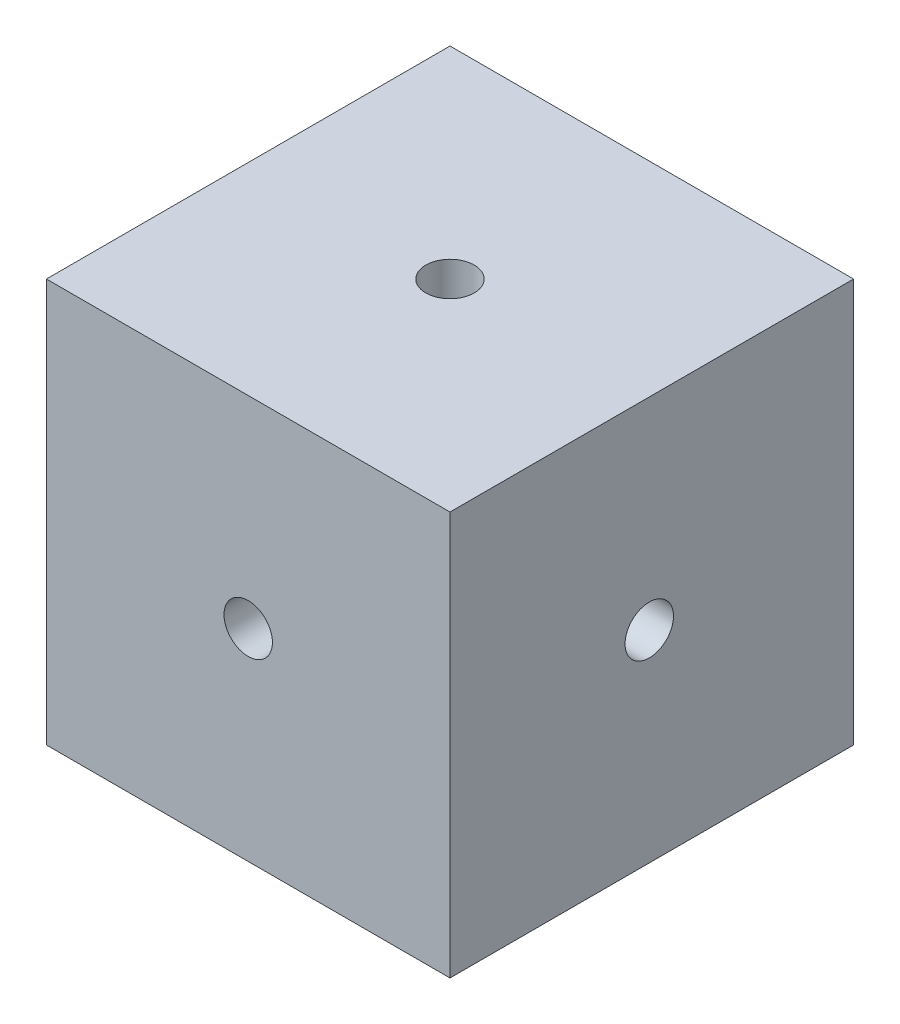
ISO-10303-21;
HEADER;
FILE_DESCRIPTION(('STEP AP214'),'2;1');
FILE_NAME('part.step','',(''),(''),'','','');
FILE_SCHEMA(('AUTOMOTIVE_DESIGN { 1 0 10303 214 1 1 1 1 }'));
ENDSEC;
DATA;
#1=APPLICATION_CONTEXT('core data for automotive mechanical design processes');
#2=APPLICATION_PROTOCOL_DEFINITION('international standard','automotive_design',2000,#1);
#3=PRODUCT_CONTEXT('',#1,'mechanical');
#4=PRODUCT('Part','Part','',(#3));
#5=PRODUCT_RELATED_PRODUCT_CATEGORY('part','',(#4));
#6=PRODUCT_DEFINITION_FORMATION('','',#4);
#7=PRODUCT_DEFINITION_CONTEXT('part definition',#1,'design');
#8=PRODUCT_DEFINITION('design','',#6,#7);
#9=PRODUCT_DEFINITION_SHAPE('','',#8);
#10=(LENGTH_UNIT() NAMED_UNIT(*) SI_UNIT(.MILLI.,.METRE.));
#11=(NAMED_UNIT(*) PLANE_ANGLE_UNIT() SI_UNIT($,.RADIAN.));
#12=(NAMED_UNIT(*) SI_UNIT($,.STERADIAN.) SOLID_ANGLE_UNIT());
#13=UNCERTAINTY_MEASURE_WITH_UNIT(LENGTH_MEASURE(1.E-05),#10,'distance_accuracy_value','');
#14=(GEOMETRIC_REPRESENTATION_CONTEXT(3) GLOBAL_UNCERTAINTY_ASSIGNED_CONTEXT((#13)) GLOBAL_UNIT_ASSIGNED_CONTEXT((#10,
#11,#12)) REPRESENTATION_CONTEXT('',''));
#15=CARTESIAN_POINT('',(0.,0.,0.));
#16=DIRECTION('',(0.,0.,1.));
#17=DIRECTION('',(1.,0.,0.));
#18=AXIS2_PLACEMENT_3D('',#15,#16,#17);
#19=CARTESIAN_POINT('',(12.5,-12.5,25.));
#20=DIRECTION('',(-1.,0.,0.));
#21=DIRECTION('',(0.,0.,1.));
#22=AXIS2_PLACEMENT_3D('',#19,#20,#21);
#23=PLANE('',#22);
#24=CARTESIAN_POINT('',(12.5,0.,12.6562450371739));
#25=DIRECTION('',(1.,0.,0.));
#26=DIRECTION('',(0.,0.,-1.));
#27=AXIS2_PLACEMENT_3D('',#24,#25,#26);
#28=CIRCLE('',#27,1.5);
#29=CARTESIAN_POINT('',(12.5,0.,11.1562450371739));
#30=VERTEX_POINT('',#29);
#31=EDGE_CURVE('E144',#30,#30,#28,.T.);
#32=ORIENTED_EDGE('',*,*,#31,.F.);
#33=EDGE_LOOP('',(#32));
#34=FACE_BOUND('',#33,.T.);
#35=DIRECTION('',(0.,1.,0.));
#36=VECTOR('',#35,1.);
#37=CARTESIAN_POINT('',(12.5,-12.5,0.));
#38=LINE('',#37,#36);
#39=CARTESIAN_POINT('',(12.5,-12.5,0.));
#40=VERTEX_POINT('',#39);
#41=CARTESIAN_POINT('',(12.5,12.5,0.));
#42=VERTEX_POINT('',#41);
#43=EDGE_CURVE('E107',#40,#42,#38,.T.);
#44=ORIENTED_EDGE('',*,*,#43,.T.);
#45=DIRECTION('',(0.,0.,-1.));
#46=VECTOR('',#45,1.);
#47=CARTESIAN_POINT('',(12.5,12.5,25.));
#48=LINE('',#47,#46);
#49=CARTESIAN_POINT('',(12.5,12.5,25.));
#50=VERTEX_POINT('',#49);
#51=EDGE_CURVE('E11',#50,#42,#48,.T.);
#52=ORIENTED_EDGE('',*,*,#51,.F.);
#53=DIRECTION('',(0.,1.,0.));
#54=VECTOR('',#53,1.);
#55=CARTESIAN_POINT('',(12.5,-12.5,25.));
#56=LINE('',#55,#54);
#57=CARTESIAN_POINT('',(12.5,-12.5,25.));
#58=VERTEX_POINT('',#57);
#59=EDGE_CURVE('E91',#58,#50,#56,.T.);
#60=ORIENTED_EDGE('',*,*,#59,.F.);
#61=DIRECTION('',(0.,0.,-1.));
#62=VECTOR('',#61,1.);
#63=CARTESIAN_POINT('',(12.5,-12.5,25.));
#64=LINE('',#63,#62);
#65=EDGE_CURVE('E103',#58,#40,#64,.T.);
#66=ORIENTED_EDGE('',*,*,#65,.T.);
#67=EDGE_LOOP('',(#44,#52,#60,#66));
#68=FACE_BOUND('',#67,.T.);
#69=ADVANCED_FACE('F39',(#34,#68),#23,.F.);
#70=CARTESIAN_POINT('',(-12.5,12.5,25.));
#71=DIRECTION('',(0.,-1.,0.));
#72=DIRECTION('',(0.,0.,-1.));
#73=AXIS2_PLACEMENT_3D('',#70,#71,#72);
#74=PLANE('',#73);
#75=CARTESIAN_POINT('',(0.,12.5,12.5));
#76=DIRECTION('',(0.,1.,0.));
#77=DIRECTION('',(0.,0.,1.));
#78=AXIS2_PLACEMENT_3D('',#75,#76,#77);
#79=CIRCLE('',#78,1.5);
#80=CARTESIAN_POINT('',(0.,12.5,14.));
#81=VERTEX_POINT('',#80);
#82=EDGE_CURVE('E128',#81,#81,#79,.T.);
#83=ORIENTED_EDGE('',*,*,#82,.F.);
#84=EDGE_LOOP('',(#83));
#85=FACE_BOUND('',#84,.T.);
#86=DIRECTION('',(-1.,0.,0.));
#87=VECTOR('',#86,1.);
#88=CARTESIAN_POINT('',(-12.5,12.5,0.));
#89=LINE('',#88,#87);
#90=CARTESIAN_POINT('',(-12.5,12.5,0.));
#91=VERTEX_POINT('',#90);
#92=EDGE_CURVE('E96',#42,#91,#89,.T.);
#93=ORIENTED_EDGE('',*,*,#92,.T.);
#94=DIRECTION('',(0.,0.,-1.));
#95=VECTOR('',#94,1.);
#96=CARTESIAN_POINT('',(-12.5,12.5,25.));
#97=LINE('',#96,#95);
#98=CARTESIAN_POINT('',(-12.5,12.5,25.));
#99=VERTEX_POINT('',#98);
#100=EDGE_CURVE('E48',#99,#91,#97,.T.);
#101=ORIENTED_EDGE('',*,*,#100,.F.);
#102=DIRECTION('',(-1.,0.,0.));
#103=VECTOR('',#102,1.);
#104=CARTESIAN_POINT('',(-12.5,12.5,25.));
#105=LINE('',#104,#103);
#106=EDGE_CURVE('E86',#50,#99,#105,.T.);
#107=ORIENTED_EDGE('',*,*,#106,.F.);
#108=ORIENTED_EDGE('',*,*,#51,.T.);
#109=EDGE_LOOP('',(#93,#101,#107,#108));
#110=FACE_BOUND('',#109,.T.);
#111=ADVANCED_FACE('F95',(#85,#110),#74,.F.);
#112=CARTESIAN_POINT('',(-12.5,-12.5,25.));
#113=DIRECTION('',(1.,0.,0.));
#114=DIRECTION('',(0.,0.,-1.));
#115=AXIS2_PLACEMENT_3D('',#112,#113,#114);
#116=PLANE('',#115);
#117=CARTESIAN_POINT('',(-12.5,0.,12.5));
#118=DIRECTION('',(-1.,0.,0.));
#119=DIRECTION('',(0.,0.,1.));
#120=AXIS2_PLACEMENT_3D('',#117,#118,#119);
#121=CIRCLE('',#120,1.5);
#122=CARTESIAN_POINT('',(-12.5,0.,14.));
#123=VERTEX_POINT('',#122);
#124=EDGE_CURVE('E160',#123,#123,#121,.T.);
#125=ORIENTED_EDGE('',*,*,#124,.F.);
#126=EDGE_LOOP('',(#125));
#127=FACE_BOUND('',#126,.T.);
#128=DIRECTION('',(0.,-1.,0.));
#129=VECTOR('',#128,1.);
#130=CARTESIAN_POINT('',(-12.5,-12.5,0.));
#131=LINE('',#130,#129);
#132=CARTESIAN_POINT('',(-12.5,-12.5,0.));
#133=VERTEX_POINT('',#132);
#134=EDGE_CURVE('E73',#91,#133,#131,.T.);
#135=ORIENTED_EDGE('',*,*,#134,.T.);
#136=DIRECTION('',(0.,0.,-1.));
#137=VECTOR('',#136,1.);
#138=CARTESIAN_POINT('',(-12.5,-12.5,25.));
#139=LINE('',#138,#137);
#140=CARTESIAN_POINT('',(-12.5,-12.5,25.));
#141=VERTEX_POINT('',#140);
#142=EDGE_CURVE('E98',#141,#133,#139,.T.);
#143=ORIENTED_EDGE('',*,*,#142,.F.);
#144=DIRECTION('',(0.,-1.,0.));
#145=VECTOR('',#144,1.);
#146=CARTESIAN_POINT('',(-12.5,-12.5,25.));
#147=LINE('',#146,#145);
#148=EDGE_CURVE('E89',#99,#141,#147,.T.);
#149=ORIENTED_EDGE('',*,*,#148,.F.);
#150=ORIENTED_EDGE('',*,*,#100,.T.);
#151=EDGE_LOOP('',(#135,#143,#149,#150));
#152=FACE_BOUND('',#151,.T.);
#153=ADVANCED_FACE('F99',(#127,#152),#116,.F.);
#154=CARTESIAN_POINT('',(-12.5,-12.5,25.));
#155=DIRECTION('',(0.,1.,0.));
#156=DIRECTION('',(0.,0.,1.));
#157=AXIS2_PLACEMENT_3D('',#154,#155,#156);
#158=PLANE('',#157);
#159=DIRECTION('',(1.,0.,0.));
#160=VECTOR('',#159,1.);
#161=CARTESIAN_POINT('',(-12.5,-12.5,0.));
#162=LINE('',#161,#160);
#163=EDGE_CURVE('E79',#133,#40,#162,.T.);
#164=ORIENTED_EDGE('',*,*,#163,.T.);
#165=ORIENTED_EDGE('',*,*,#65,.F.);
#166=DIRECTION('',(1.,0.,0.));
#167=VECTOR('',#166,1.);
#168=CARTESIAN_POINT('',(-12.5,-12.5,25.));
#169=LINE('',#168,#167);
#170=EDGE_CURVE('E56',#141,#58,#169,.T.);
#171=ORIENTED_EDGE('',*,*,#170,.F.);
#172=ORIENTED_EDGE('',*,*,#142,.T.);
#173=EDGE_LOOP('',(#164,#165,#171,#172));
#174=FACE_BOUND('',#173,.T.);
#175=ADVANCED_FACE('F121',(#174),#158,.F.);
#176=CARTESIAN_POINT('',(0.,0.,25.));
#177=DIRECTION('',(0.,0.,-1.));
#178=DIRECTION('',(-1.,0.,0.));
#179=AXIS2_PLACEMENT_3D('',#176,#177,#178);
#180=PLANE('',#179);
#181=CARTESIAN_POINT('',(0.,0.,25.));
#182=DIRECTION('',(0.,0.,1.));
#183=DIRECTION('',(1.,0.,0.));
#184=AXIS2_PLACEMENT_3D('',#181,#182,#183);
#185=CIRCLE('',#184,1.5);
#186=CARTESIAN_POINT('',(1.5,0.,25.));
#187=VERTEX_POINT('',#186);
#188=EDGE_CURVE('E136',#187,#187,#185,.T.);
#189=ORIENTED_EDGE('',*,*,#188,.F.);
#190=EDGE_LOOP('',(#189));
#191=FACE_BOUND('',#190,.T.);
#192=ORIENTED_EDGE('',*,*,#59,.T.);
#193=ORIENTED_EDGE('',*,*,#106,.T.);
#194=ORIENTED_EDGE('',*,*,#148,.T.);
#195=ORIENTED_EDGE('',*,*,#170,.T.);
#196=EDGE_LOOP('',(#192,#193,#194,#195));
#197=FACE_BOUND('',#196,.T.);
#198=ADVANCED_FACE('F87',(#191,#197),#180,.F.);
#199=CARTESIAN_POINT('',(0.,0.,0.));
#200=DIRECTION('',(0.,0.,-1.));
#201=DIRECTION('',(-1.,0.,0.));
#202=AXIS2_PLACEMENT_3D('',#199,#200,#201);
#203=PLANE('',#202);
#204=CARTESIAN_POINT('',(0.,0.,0.));
#205=DIRECTION('',(0.,0.,-1.));
#206=DIRECTION('',(-1.,0.,0.));
#207=AXIS2_PLACEMENT_3D('',#204,#205,#206);
#208=CIRCLE('',#207,1.5);
#209=CARTESIAN_POINT('',(-1.5,0.,0.));
#210=VERTEX_POINT('',#209);
#211=EDGE_CURVE('E152',#210,#210,#208,.T.);
#212=ORIENTED_EDGE('',*,*,#211,.F.);
#213=EDGE_LOOP('',(#212));
#214=FACE_BOUND('',#213,.T.);
#215=ORIENTED_EDGE('',*,*,#43,.F.);
#216=ORIENTED_EDGE('',*,*,#163,.F.);
#217=ORIENTED_EDGE('',*,*,#134,.F.);
#218=ORIENTED_EDGE('',*,*,#92,.F.);
#219=EDGE_LOOP('',(#215,#216,#217,#218));
#220=FACE_BOUND('',#219,.T.);
#221=ADVANCED_FACE('F124',(#214,#220),#203,.T.);
#222=CARTESIAN_POINT('',(0.,5.5,12.5));
#223=DIRECTION('',(0.,1.,0.));
#224=DIRECTION('',(0.,0.,1.));
#225=AXIS2_PLACEMENT_3D('',#222,#223,#224);
#226=CYLINDRICAL_SURFACE('',#225,1.5);
#227=CARTESIAN_POINT('',(0.,5.5,12.5));
#228=DIRECTION('',(0.,1.,0.));
#229=DIRECTION('',(0.,0.,1.));
#230=AXIS2_PLACEMENT_3D('',#227,#228,#229);
#231=CIRCLE('',#230,1.5);
#232=CARTESIAN_POINT('',(0.,5.5,14.));
#233=VERTEX_POINT('',#232);
#234=EDGE_CURVE('E111',#233,#233,#231,.T.);
#235=ORIENTED_EDGE('',*,*,#234,.F.);
#236=EDGE_LOOP('',(#235));
#237=FACE_BOUND('',#236,.T.);
#238=ORIENTED_EDGE('',*,*,#82,.T.);
#239=EDGE_LOOP('',(#238));
#240=FACE_BOUND('',#239,.T.);
#241=ADVANCED_FACE('F216',(#237,#240),#226,.F.);
#242=CARTESIAN_POINT('',(0.,5.5,12.5));
#243=DIRECTION('',(0.,1.,0.));
#244=DIRECTION('',(0.,0.,1.));
#245=AXIS2_PLACEMENT_3D('',#242,#243,#244);
#246=PLANE('',#245);
#247=ORIENTED_EDGE('',*,*,#234,.T.);
#248=EDGE_LOOP('',(#247));
#249=FACE_BOUND('',#248,.T.);
#250=ADVANCED_FACE('F212',(#249),#246,.T.);
#251=CARTESIAN_POINT('',(0.,0.,18.));
#252=DIRECTION('',(0.,0.,1.));
#253=DIRECTION('',(1.,0.,0.));
#254=AXIS2_PLACEMENT_3D('',#251,#252,#253);
#255=CYLINDRICAL_SURFACE('',#254,1.5);
#256=CARTESIAN_POINT('',(0.,0.,18.));
#257=DIRECTION('',(0.,0.,1.));
#258=DIRECTION('',(1.,0.,0.));
#259=AXIS2_PLACEMENT_3D('',#256,#257,#258);
#260=CIRCLE('',#259,1.5);
#261=CARTESIAN_POINT('',(1.5,0.,18.));
#262=VERTEX_POINT('',#261);
#263=EDGE_CURVE('E132',#262,#262,#260,.T.);
#264=ORIENTED_EDGE('',*,*,#263,.F.);
#265=EDGE_LOOP('',(#264));
#266=FACE_BOUND('',#265,.T.);
#267=ORIENTED_EDGE('',*,*,#188,.T.);
#268=EDGE_LOOP('',(#267));
#269=FACE_BOUND('',#268,.T.);
#270=ADVANCED_FACE('F204',(#266,#269),#255,.F.);
#271=CARTESIAN_POINT('',(0.,0.,18.));
#272=DIRECTION('',(0.,0.,1.));
#273=DIRECTION('',(1.,0.,0.));
#274=AXIS2_PLACEMENT_3D('',#271,#272,#273);
#275=PLANE('',#274);
#276=ORIENTED_EDGE('',*,*,#263,.T.);
#277=EDGE_LOOP('',(#276));
#278=FACE_BOUND('',#277,.T.);
#279=ADVANCED_FACE('F194',(#278),#275,.T.);
#280=CARTESIAN_POINT('',(5.5,0.,12.6562450371739));
#281=DIRECTION('',(1.,0.,0.));
#282=DIRECTION('',(0.,0.,-1.));
#283=AXIS2_PLACEMENT_3D('',#280,#281,#282);
#284=CYLINDRICAL_SURFACE('',#283,1.5);
#285=CARTESIAN_POINT('',(5.5,0.,12.6562450371739));
#286=DIRECTION('',(1.,0.,0.));
#287=DIRECTION('',(0.,0.,-1.));
#288=AXIS2_PLACEMENT_3D('',#285,#286,#287);
#289=CIRCLE('',#288,1.5);
#290=CARTESIAN_POINT('',(5.5,0.,11.1562450371739));
#291=VERTEX_POINT('',#290);
#292=EDGE_CURVE('E140',#291,#291,#289,.T.);
#293=ORIENTED_EDGE('',*,*,#292,.F.);
#294=EDGE_LOOP('',(#293));
#295=FACE_BOUND('',#294,.T.);
#296=ORIENTED_EDGE('',*,*,#31,.T.);
#297=EDGE_LOOP('',(#296));
#298=FACE_BOUND('',#297,.T.);
#299=ADVANCED_FACE('F191',(#295,#298),#284,.F.);
#300=CARTESIAN_POINT('',(5.5,0.,12.6562450371739));
#301=DIRECTION('',(1.,0.,0.));
#302=DIRECTION('',(0.,0.,-1.));
#303=AXIS2_PLACEMENT_3D('',#300,#301,#302);
#304=PLANE('',#303);
#305=ORIENTED_EDGE('',*,*,#292,.T.);
#306=EDGE_LOOP('',(#305));
#307=FACE_BOUND('',#306,.T.);
#308=ADVANCED_FACE('F193',(#307),#304,.T.);
#309=CARTESIAN_POINT('',(0.,0.,7.));
#310=DIRECTION('',(0.,0.,-1.));
#311=DIRECTION('',(-1.,0.,0.));
#312=AXIS2_PLACEMENT_3D('',#309,#310,#311);
#313=CYLINDRICAL_SURFACE('',#312,1.5);
#314=CARTESIAN_POINT('',(0.,0.,7.));
#315=DIRECTION('',(0.,0.,-1.));
#316=DIRECTION('',(-1.,0.,0.));
#317=AXIS2_PLACEMENT_3D('',#314,#315,#316);
#318=CIRCLE('',#317,1.5);
#319=CARTESIAN_POINT('',(-1.5,0.,7.));
#320=VERTEX_POINT('',#319);
#321=EDGE_CURVE('E148',#320,#320,#318,.T.);
#322=ORIENTED_EDGE('',*,*,#321,.F.);
#323=EDGE_LOOP('',(#322));
#324=FACE_BOUND('',#323,.T.);
#325=ORIENTED_EDGE('',*,*,#211,.T.);
#326=EDGE_LOOP('',(#325));
#327=FACE_BOUND('',#326,.T.);
#328=ADVANCED_FACE('F201',(#324,#327),#313,.F.);
#329=CARTESIAN_POINT('',(0.,0.,7.));
#330=DIRECTION('',(0.,0.,-1.));
#331=DIRECTION('',(-1.,0.,0.));
#332=AXIS2_PLACEMENT_3D('',#329,#330,#331);
#333=PLANE('',#332);
#334=ORIENTED_EDGE('',*,*,#321,.T.);
#335=EDGE_LOOP('',(#334));
#336=FACE_BOUND('',#335,.T.);
#337=ADVANCED_FACE('F173',(#336),#333,.T.);
#338=CARTESIAN_POINT('',(-5.5,0.,12.5));
#339=DIRECTION('',(-1.,0.,0.));
#340=DIRECTION('',(0.,0.,1.));
#341=AXIS2_PLACEMENT_3D('',#338,#339,#340);
#342=CYLINDRICAL_SURFACE('',#341,1.5);
#343=CARTESIAN_POINT('',(-5.5,0.,12.5));
#344=DIRECTION('',(-1.,0.,0.));
#345=DIRECTION('',(0.,0.,1.));
#346=AXIS2_PLACEMENT_3D('',#343,#344,#345);
#347=CIRCLE('',#346,1.5);
#348=CARTESIAN_POINT('',(-5.5,0.,14.));
#349=VERTEX_POINT('',#348);
#350=EDGE_CURVE('E156',#349,#349,#347,.T.);
#351=ORIENTED_EDGE('',*,*,#350,.F.);
#352=EDGE_LOOP('',(#351));
#353=FACE_BOUND('',#352,.T.);
#354=ORIENTED_EDGE('',*,*,#124,.T.);
#355=EDGE_LOOP('',(#354));
#356=FACE_BOUND('',#355,.T.);
#357=ADVANCED_FACE('F170',(#353,#356),#342,.F.);
#358=CARTESIAN_POINT('',(-5.5,0.,12.5));
#359=DIRECTION('',(-1.,0.,0.));
#360=DIRECTION('',(0.,0.,1.));
#361=AXIS2_PLACEMENT_3D('',#358,#359,#360);
#362=PLANE('',#361);
#363=ORIENTED_EDGE('',*,*,#350,.T.);
#364=EDGE_LOOP('',(#363));
#365=FACE_BOUND('',#364,.T.);
#366=ADVANCED_FACE('F168',(#365),#362,.T.);
#367=CLOSED_SHELL('',(#69,#111,#153,#175,#198,#221,#241,#250,#270,#279,#299,#308,#328,#337,#357,#366));
#368=MANIFOLD_SOLID_BREP('B2',#367);
#369=ADVANCED_BREP_SHAPE_REPRESENTATION('',(#18,#368),#14);
#370=SHAPE_DEFINITION_REPRESENTATION(#9,#369);
ENDSEC;
END-ISO-10303-21;
